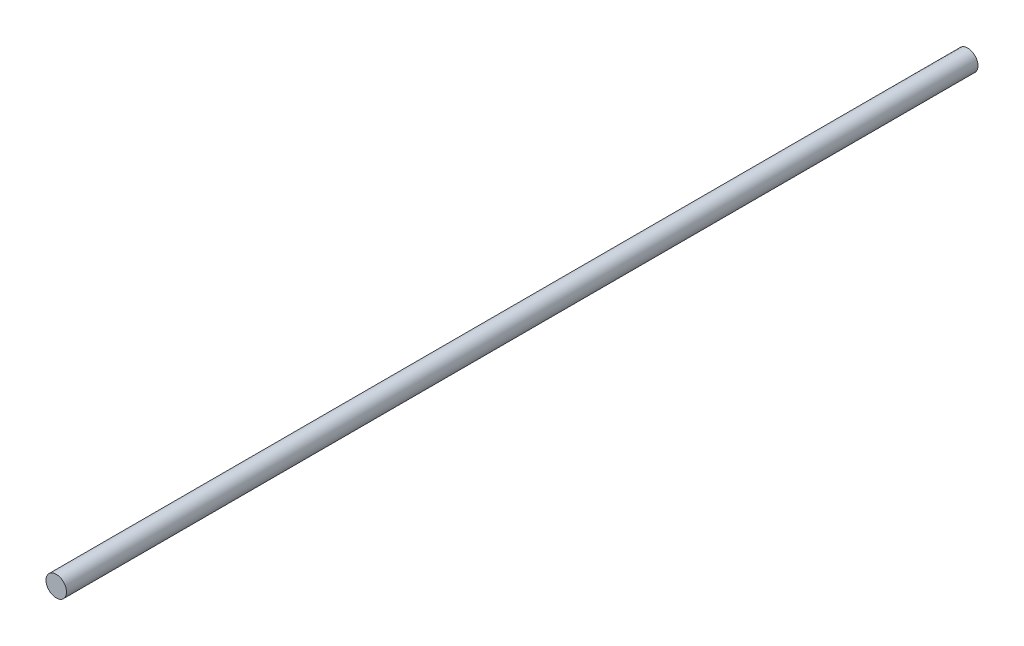
ISO-10303-21;
HEADER;
FILE_DESCRIPTION(('STEP AP214'),'2;1');
FILE_NAME('part.step','',(''),(''),'','','');
FILE_SCHEMA(('AUTOMOTIVE_DESIGN { 1 0 10303 214 1 1 1 1 }'));
ENDSEC;
DATA;
#1=APPLICATION_CONTEXT('core data for automotive mechanical design processes');
#2=APPLICATION_PROTOCOL_DEFINITION('international standard','automotive_design',2000,#1);
#3=PRODUCT_CONTEXT('',#1,'mechanical');
#4=PRODUCT('Part','Part','',(#3));
#5=PRODUCT_RELATED_PRODUCT_CATEGORY('part','',(#4));
#6=PRODUCT_DEFINITION_FORMATION('','',#4);
#7=PRODUCT_DEFINITION_CONTEXT('part definition',#1,'design');
#8=PRODUCT_DEFINITION('design','',#6,#7);
#9=PRODUCT_DEFINITION_SHAPE('','',#8);
#10=(LENGTH_UNIT() NAMED_UNIT(*) SI_UNIT(.MILLI.,.METRE.));
#11=(NAMED_UNIT(*) PLANE_ANGLE_UNIT() SI_UNIT($,.RADIAN.));
#12=(NAMED_UNIT(*) SI_UNIT($,.STERADIAN.) SOLID_ANGLE_UNIT());
#13=UNCERTAINTY_MEASURE_WITH_UNIT(LENGTH_MEASURE(1.E-05),#10,'distance_accuracy_value','');
#14=(GEOMETRIC_REPRESENTATION_CONTEXT(3) GLOBAL_UNCERTAINTY_ASSIGNED_CONTEXT((#13)) GLOBAL_UNIT_ASSIGNED_CONTEXT((#10,
#11,#12)) REPRESENTATION_CONTEXT('',''));
#15=CARTESIAN_POINT('',(0.,0.,0.));
#16=DIRECTION('',(0.,0.,1.));
#17=DIRECTION('',(1.,0.,0.));
#18=AXIS2_PLACEMENT_3D('',#15,#16,#17);
#19=CARTESIAN_POINT('',(0.,0.,400.));
#20=DIRECTION('',(0.,0.,-1.));
#21=DIRECTION('',(-1.,0.,0.));
#22=AXIS2_PLACEMENT_3D('',#19,#20,#21);
#23=CYLINDRICAL_SURFACE('',#22,4.5);
#24=CARTESIAN_POINT('',(0.,0.,400.));
#25=DIRECTION('',(0.,0.,1.));
#26=DIRECTION('',(1.,0.,0.));
#27=AXIS2_PLACEMENT_3D('',#24,#25,#26);
#28=CIRCLE('',#27,4.5);
#29=CARTESIAN_POINT('',(4.5,0.,400.));
#30=VERTEX_POINT('',#29);
#31=EDGE_CURVE('E10',#30,#30,#28,.T.);
#32=ORIENTED_EDGE('',*,*,#31,.F.);
#33=EDGE_LOOP('',(#32));
#34=FACE_BOUND('',#33,.T.);
#35=CARTESIAN_POINT('',(0.,0.,0.));
#36=DIRECTION('',(0.,0.,1.));
#37=DIRECTION('',(1.,0.,0.));
#38=AXIS2_PLACEMENT_3D('',#35,#36,#37);
#39=CIRCLE('',#38,4.5);
#40=CARTESIAN_POINT('',(4.5,0.,0.));
#41=VERTEX_POINT('',#40);
#42=EDGE_CURVE('E38',#41,#41,#39,.T.);
#43=ORIENTED_EDGE('',*,*,#42,.T.);
#44=EDGE_LOOP('',(#43));
#45=FACE_BOUND('',#44,.T.);
#46=ADVANCED_FACE('F35',(#34,#45),#23,.T.);
#47=CARTESIAN_POINT('',(0.,0.,400.));
#48=DIRECTION('',(0.,0.,1.));
#49=DIRECTION('',(1.,0.,0.));
#50=AXIS2_PLACEMENT_3D('',#47,#48,#49);
#51=PLANE('',#50);
#52=ORIENTED_EDGE('',*,*,#31,.T.);
#53=EDGE_LOOP('',(#52));
#54=FACE_BOUND('',#53,.T.);
#55=ADVANCED_FACE('F50',(#54),#51,.T.);
#56=CARTESIAN_POINT('',(0.,0.,0.));
#57=DIRECTION('',(0.,0.,1.));
#58=DIRECTION('',(1.,0.,0.));
#59=AXIS2_PLACEMENT_3D('',#56,#57,#58);
#60=PLANE('',#59);
#61=ORIENTED_EDGE('',*,*,#42,.F.);
#62=EDGE_LOOP('',(#61));
#63=FACE_BOUND('',#62,.T.);
#64=ADVANCED_FACE('F48',(#63),#60,.F.);
#65=CLOSED_SHELL('',(#46,#55,#64));
#66=MANIFOLD_SOLID_BREP('B2',#65);
#67=ADVANCED_BREP_SHAPE_REPRESENTATION('',(#18,#66),#14);
#68=SHAPE_DEFINITION_REPRESENTATION(#9,#67);
ENDSEC;
END-ISO-10303-21;
